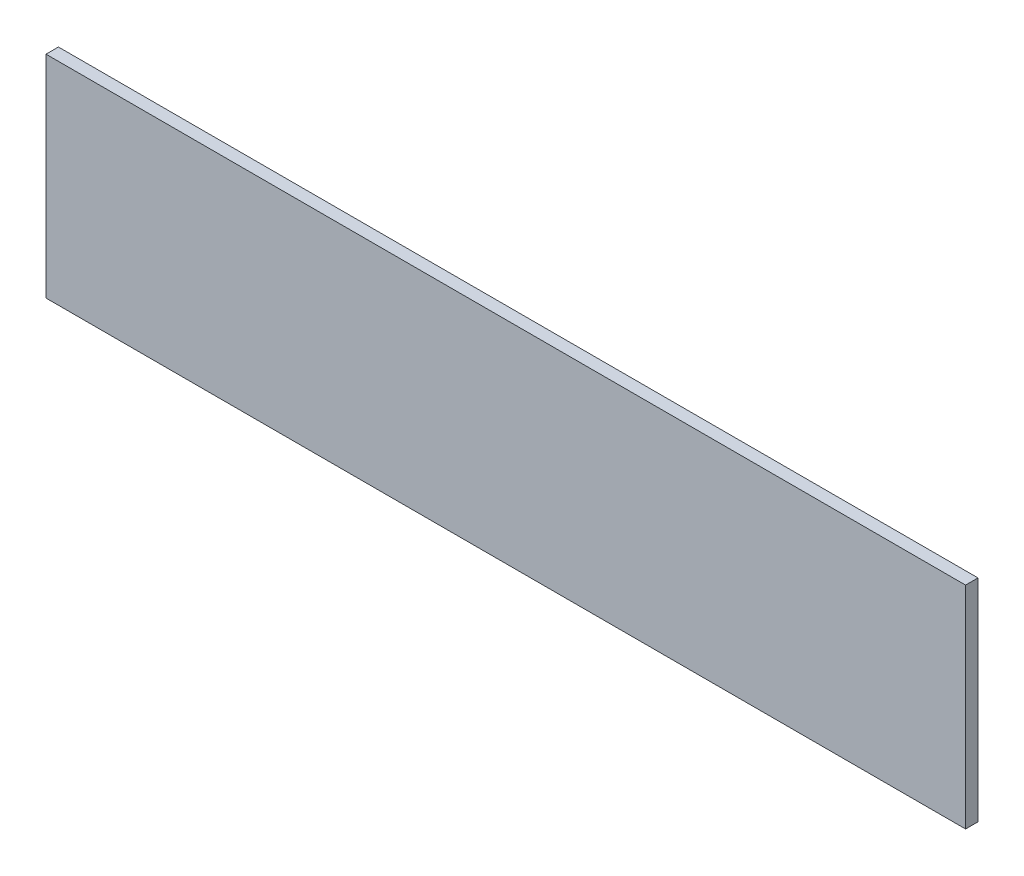
ISO-10303-21;
HEADER;
FILE_DESCRIPTION(('STEP AP214'),'2;1');
FILE_NAME('part.step','',(''),(''),'','','');
FILE_SCHEMA(('AUTOMOTIVE_DESIGN { 1 0 10303 214 1 1 1 1 }'));
ENDSEC;
DATA;
#1=APPLICATION_CONTEXT('core data for automotive mechanical design processes');
#2=APPLICATION_PROTOCOL_DEFINITION('international standard','automotive_design',2000,#1);
#3=PRODUCT_CONTEXT('',#1,'mechanical');
#4=PRODUCT('Part','Part','',(#3));
#5=PRODUCT_RELATED_PRODUCT_CATEGORY('part','',(#4));
#6=PRODUCT_DEFINITION_FORMATION('','',#4);
#7=PRODUCT_DEFINITION_CONTEXT('part definition',#1,'design');
#8=PRODUCT_DEFINITION('design','',#6,#7);
#9=PRODUCT_DEFINITION_SHAPE('','',#8);
#10=(LENGTH_UNIT() NAMED_UNIT(*) SI_UNIT(.MILLI.,.METRE.));
#11=(NAMED_UNIT(*) PLANE_ANGLE_UNIT() SI_UNIT($,.RADIAN.));
#12=(NAMED_UNIT(*) SI_UNIT($,.STERADIAN.) SOLID_ANGLE_UNIT());
#13=UNCERTAINTY_MEASURE_WITH_UNIT(LENGTH_MEASURE(1.E-05),#10,'distance_accuracy_value','');
#14=(GEOMETRIC_REPRESENTATION_CONTEXT(3) GLOBAL_UNCERTAINTY_ASSIGNED_CONTEXT((#13)) GLOBAL_UNIT_ASSIGNED_CONTEXT((#10,
#11,#12)) REPRESENTATION_CONTEXT('',''));
#15=CARTESIAN_POINT('',(0.,0.,0.));
#16=DIRECTION('',(0.,0.,1.));
#17=DIRECTION('',(1.,0.,0.));
#18=AXIS2_PLACEMENT_3D('',#15,#16,#17);
#19=CARTESIAN_POINT('',(-234.95,6.22659010600706,3.175));
#20=DIRECTION('',(1.,0.,0.));
#21=DIRECTION('',(0.,0.,-1.));
#22=AXIS2_PLACEMENT_3D('',#19,#20,#21);
#23=PLANE('',#22);
#24=DIRECTION('',(0.,-1.,0.));
#25=VECTOR('',#24,1.);
#26=CARTESIAN_POINT('',(-234.95,6.22659010600706,0.));
#27=LINE('',#26,#25);
#28=CARTESIAN_POINT('',(-234.95,60.2015901060071,0.));
#29=VERTEX_POINT('',#28);
#30=CARTESIAN_POINT('',(-234.95,6.22659010600706,0.));
#31=VERTEX_POINT('',#30);
#32=EDGE_CURVE('E96',#29,#31,#27,.T.);
#33=ORIENTED_EDGE('',*,*,#32,.T.);
#34=DIRECTION('',(0.,0.,-1.));
#35=VECTOR('',#34,1.);
#36=CARTESIAN_POINT('',(-234.95,6.22659010600706,3.175));
#37=LINE('',#36,#35);
#38=CARTESIAN_POINT('',(-234.95,6.22659010600706,3.175));
#39=VERTEX_POINT('',#38);
#40=EDGE_CURVE('E11',#39,#31,#37,.T.);
#41=ORIENTED_EDGE('',*,*,#40,.F.);
#42=DIRECTION('',(0.,-1.,0.));
#43=VECTOR('',#42,1.);
#44=CARTESIAN_POINT('',(-234.95,6.22659010600706,3.175));
#45=LINE('',#44,#43);
#46=CARTESIAN_POINT('',(-234.95,60.2015901060071,3.175));
#47=VERTEX_POINT('',#46);
#48=EDGE_CURVE('E84',#47,#39,#45,.T.);
#49=ORIENTED_EDGE('',*,*,#48,.F.);
#50=DIRECTION('',(0.,0.,-1.));
#51=VECTOR('',#50,1.);
#52=CARTESIAN_POINT('',(-234.95,60.2015901060071,3.175));
#53=LINE('',#52,#51);
#54=EDGE_CURVE('E92',#47,#29,#53,.T.);
#55=ORIENTED_EDGE('',*,*,#54,.T.);
#56=EDGE_LOOP('',(#33,#41,#49,#55));
#57=FACE_BOUND('',#56,.T.);
#58=ADVANCED_FACE('F33',(#57),#23,.F.);
#59=CARTESIAN_POINT('',(-234.95,6.22659010600706,3.175));
#60=DIRECTION('',(0.,1.,0.));
#61=DIRECTION('',(0.,0.,1.));
#62=AXIS2_PLACEMENT_3D('',#59,#60,#61);
#63=PLANE('',#62);
#64=DIRECTION('',(1.,0.,0.));
#65=VECTOR('',#64,1.);
#66=CARTESIAN_POINT('',(-234.95,6.22659010600706,0.));
#67=LINE('',#66,#65);
#68=CARTESIAN_POINT('',(0.,6.22659010600706,0.));
#69=VERTEX_POINT('',#68);
#70=EDGE_CURVE('E88',#31,#69,#67,.T.);
#71=ORIENTED_EDGE('',*,*,#70,.T.);
#72=DIRECTION('',(0.,0.,-1.));
#73=VECTOR('',#72,1.);
#74=CARTESIAN_POINT('',(0.,6.22659010600706,3.175));
#75=LINE('',#74,#73);
#76=CARTESIAN_POINT('',(0.,6.22659010600706,3.175));
#77=VERTEX_POINT('',#76);
#78=EDGE_CURVE('E41',#77,#69,#75,.T.);
#79=ORIENTED_EDGE('',*,*,#78,.F.);
#80=DIRECTION('',(1.,0.,0.));
#81=VECTOR('',#80,1.);
#82=CARTESIAN_POINT('',(-234.95,6.22659010600706,3.175));
#83=LINE('',#82,#81);
#84=EDGE_CURVE('E79',#39,#77,#83,.T.);
#85=ORIENTED_EDGE('',*,*,#84,.F.);
#86=ORIENTED_EDGE('',*,*,#40,.T.);
#87=EDGE_LOOP('',(#71,#79,#85,#86));
#88=FACE_BOUND('',#87,.T.);
#89=ADVANCED_FACE('F87',(#88),#63,.F.);
#90=CARTESIAN_POINT('',(0.,6.22659010600706,3.175));
#91=DIRECTION('',(-1.,0.,0.));
#92=DIRECTION('',(0.,0.,1.));
#93=AXIS2_PLACEMENT_3D('',#90,#91,#92);
#94=PLANE('',#93);
#95=DIRECTION('',(0.,1.,0.));
#96=VECTOR('',#95,1.);
#97=CARTESIAN_POINT('',(0.,6.22659010600706,0.));
#98=LINE('',#97,#96);
#99=CARTESIAN_POINT('',(0.,60.2015901060071,0.));
#100=VERTEX_POINT('',#99);
#101=EDGE_CURVE('E66',#69,#100,#98,.T.);
#102=ORIENTED_EDGE('',*,*,#101,.T.);
#103=DIRECTION('',(0.,0.,-1.));
#104=VECTOR('',#103,1.);
#105=CARTESIAN_POINT('',(0.,60.2015901060071,3.175));
#106=LINE('',#105,#104);
#107=CARTESIAN_POINT('',(0.,60.2015901060071,3.175));
#108=VERTEX_POINT('',#107);
#109=EDGE_CURVE('E89',#108,#100,#106,.T.);
#110=ORIENTED_EDGE('',*,*,#109,.F.);
#111=DIRECTION('',(0.,1.,0.));
#112=VECTOR('',#111,1.);
#113=CARTESIAN_POINT('',(0.,6.22659010600706,3.175));
#114=LINE('',#113,#112);
#115=EDGE_CURVE('E82',#77,#108,#114,.T.);
#116=ORIENTED_EDGE('',*,*,#115,.F.);
#117=ORIENTED_EDGE('',*,*,#78,.T.);
#118=EDGE_LOOP('',(#102,#110,#116,#117));
#119=FACE_BOUND('',#118,.T.);
#120=ADVANCED_FACE('F90',(#119),#94,.F.);
#121=CARTESIAN_POINT('',(-234.95,60.2015901060071,3.175));
#122=DIRECTION('',(0.,-1.,0.));
#123=DIRECTION('',(1.,0.,0.));
#124=AXIS2_PLACEMENT_3D('',#121,#122,#123);
#125=PLANE('',#124);
#126=DIRECTION('',(-1.,0.,0.));
#127=VECTOR('',#126,1.);
#128=CARTESIAN_POINT('',(-234.95,60.2015901060071,0.));
#129=LINE('',#128,#127);
#130=EDGE_CURVE('E72',#100,#29,#129,.T.);
#131=ORIENTED_EDGE('',*,*,#130,.T.);
#132=ORIENTED_EDGE('',*,*,#54,.F.);
#133=DIRECTION('',(-1.,0.,0.));
#134=VECTOR('',#133,1.);
#135=CARTESIAN_POINT('',(-234.95,60.2015901060071,3.175));
#136=LINE('',#135,#134);
#137=EDGE_CURVE('E49',#108,#47,#136,.T.);
#138=ORIENTED_EDGE('',*,*,#137,.F.);
#139=ORIENTED_EDGE('',*,*,#109,.T.);
#140=EDGE_LOOP('',(#131,#132,#138,#139));
#141=FACE_BOUND('',#140,.T.);
#142=ADVANCED_FACE('F103',(#141),#125,.F.);
#143=CARTESIAN_POINT('',(0.,0.,3.175));
#144=DIRECTION('',(0.,0.,-1.));
#145=DIRECTION('',(-1.,0.,0.));
#146=AXIS2_PLACEMENT_3D('',#143,#144,#145);
#147=PLANE('',#146);
#148=ORIENTED_EDGE('',*,*,#48,.T.);
#149=ORIENTED_EDGE('',*,*,#84,.T.);
#150=ORIENTED_EDGE('',*,*,#115,.T.);
#151=ORIENTED_EDGE('',*,*,#137,.T.);
#152=EDGE_LOOP('',(#148,#149,#150,#151));
#153=FACE_BOUND('',#152,.T.);
#154=ADVANCED_FACE('F80',(#153),#147,.F.);
#155=CARTESIAN_POINT('',(0.,0.,0.));
#156=DIRECTION('',(0.,0.,-1.));
#157=DIRECTION('',(-1.,0.,0.));
#158=AXIS2_PLACEMENT_3D('',#155,#156,#157);
#159=PLANE('',#158);
#160=ORIENTED_EDGE('',*,*,#32,.F.);
#161=ORIENTED_EDGE('',*,*,#130,.F.);
#162=ORIENTED_EDGE('',*,*,#101,.F.);
#163=ORIENTED_EDGE('',*,*,#70,.F.);
#164=EDGE_LOOP('',(#160,#161,#162,#163));
#165=FACE_BOUND('',#164,.T.);
#166=ADVANCED_FACE('F106',(#165),#159,.T.);
#167=CLOSED_SHELL('',(#58,#89,#120,#142,#154,#166));
#168=MANIFOLD_SOLID_BREP('B2',#167);
#169=ADVANCED_BREP_SHAPE_REPRESENTATION('',(#18,#168),#14);
#170=SHAPE_DEFINITION_REPRESENTATION(#9,#169);
ENDSEC;
END-ISO-10303-21;
